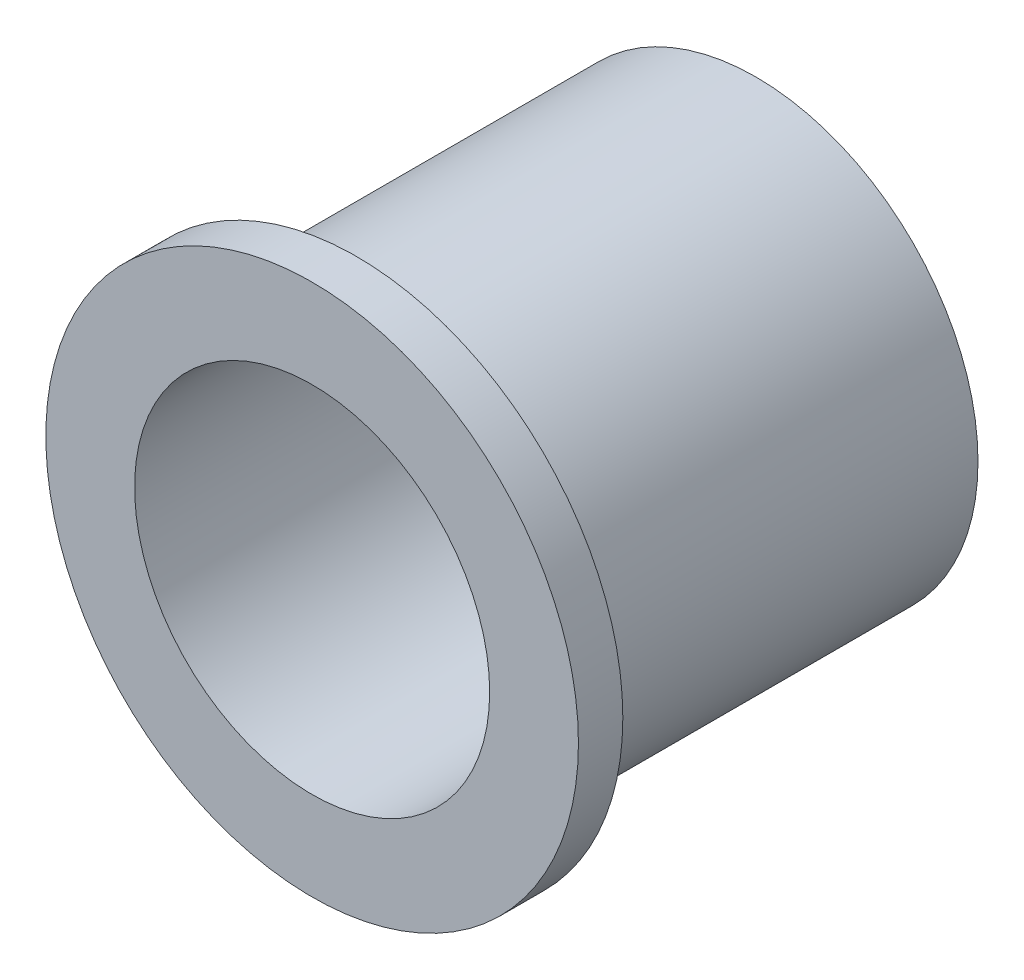
ISO-10303-21;
HEADER;
FILE_DESCRIPTION(('STEP AP214'),'2;1');
FILE_NAME('part.step','',(''),(''),'','','');
FILE_SCHEMA(('AUTOMOTIVE_DESIGN { 1 0 10303 214 1 1 1 1 }'));
ENDSEC;
DATA;
#1=APPLICATION_CONTEXT('core data for automotive mechanical design processes');
#2=APPLICATION_PROTOCOL_DEFINITION('international standard','automotive_design',2000,#1);
#3=PRODUCT_CONTEXT('',#1,'mechanical');
#4=PRODUCT('Part','Part','',(#3));
#5=PRODUCT_RELATED_PRODUCT_CATEGORY('part','',(#4));
#6=PRODUCT_DEFINITION_FORMATION('','',#4);
#7=PRODUCT_DEFINITION_CONTEXT('part definition',#1,'design');
#8=PRODUCT_DEFINITION('design','',#6,#7);
#9=PRODUCT_DEFINITION_SHAPE('','',#8);
#10=(LENGTH_UNIT() NAMED_UNIT(*) SI_UNIT(.MILLI.,.METRE.));
#11=(NAMED_UNIT(*) PLANE_ANGLE_UNIT() SI_UNIT($,.RADIAN.));
#12=(NAMED_UNIT(*) SI_UNIT($,.STERADIAN.) SOLID_ANGLE_UNIT());
#13=UNCERTAINTY_MEASURE_WITH_UNIT(LENGTH_MEASURE(1.E-05),#10,'distance_accuracy_value','');
#14=(GEOMETRIC_REPRESENTATION_CONTEXT(3) GLOBAL_UNCERTAINTY_ASSIGNED_CONTEXT((#13)) GLOBAL_UNIT_ASSIGNED_CONTEXT((#10,
#11,#12)) REPRESENTATION_CONTEXT('',''));
#15=CARTESIAN_POINT('',(0.,0.,0.));
#16=DIRECTION('',(0.,0.,1.));
#17=DIRECTION('',(1.,0.,0.));
#18=AXIS2_PLACEMENT_3D('',#15,#16,#17);
#19=CARTESIAN_POINT('',(0.,0.,15.875));
#20=DIRECTION('',(0.,0.,-1.));
#21=DIRECTION('',(-1.,0.,0.));
#22=AXIS2_PLACEMENT_3D('',#19,#20,#21);
#23=CYLINDRICAL_SURFACE('',#22,15.88135);
#24=CARTESIAN_POINT('',(0.,0.,-15.875));
#25=DIRECTION('',(0.,0.,1.));
#26=DIRECTION('',(1.,0.,0.));
#27=AXIS2_PLACEMENT_3D('',#24,#25,#26);
#28=CIRCLE('',#27,15.88135);
#29=CARTESIAN_POINT('',(15.88135,0.,-15.875));
#30=VERTEX_POINT('',#29);
#31=EDGE_CURVE('E45',#30,#30,#28,.T.);
#32=ORIENTED_EDGE('',*,*,#31,.T.);
#33=EDGE_LOOP('',(#32));
#34=FACE_BOUND('',#33,.T.);
#35=CARTESIAN_POINT('',(0.,0.,12.7));
#36=DIRECTION('',(0.,0.,1.));
#37=DIRECTION('',(1.,0.,0.));
#38=AXIS2_PLACEMENT_3D('',#35,#36,#37);
#39=CIRCLE('',#38,15.88135);
#40=CARTESIAN_POINT('',(15.88135,0.,12.7));
#41=VERTEX_POINT('',#40);
#42=EDGE_CURVE('E10',#41,#41,#39,.T.);
#43=ORIENTED_EDGE('',*,*,#42,.F.);
#44=EDGE_LOOP('',(#43));
#45=FACE_BOUND('',#44,.T.);
#46=ADVANCED_FACE('F34',(#34,#45),#23,.T.);
#47=CARTESIAN_POINT('',(0.,0.,15.875));
#48=DIRECTION('',(0.,0.,1.));
#49=DIRECTION('',(1.,0.,0.));
#50=AXIS2_PLACEMENT_3D('',#47,#48,#49);
#51=PLANE('',#50);
#52=CARTESIAN_POINT('',(0.,0.,15.875));
#53=DIRECTION('',(0.,0.,1.));
#54=DIRECTION('',(1.,0.,0.));
#55=AXIS2_PLACEMENT_3D('',#52,#53,#54);
#56=CIRCLE('',#55,12.7);
#57=CARTESIAN_POINT('',(12.7,0.,15.875));
#58=VERTEX_POINT('',#57);
#59=EDGE_CURVE('E37',#58,#58,#56,.T.);
#60=ORIENTED_EDGE('',*,*,#59,.F.);
#61=EDGE_LOOP('',(#60));
#62=FACE_BOUND('',#61,.T.);
#63=CARTESIAN_POINT('',(0.,0.,15.875));
#64=DIRECTION('',(0.,0.,1.));
#65=DIRECTION('',(1.,0.,0.));
#66=AXIS2_PLACEMENT_3D('',#63,#64,#65);
#67=CIRCLE('',#66,19.05);
#68=CARTESIAN_POINT('',(19.05,0.,15.875));
#69=VERTEX_POINT('',#68);
#70=EDGE_CURVE('E52',#69,#69,#67,.T.);
#71=ORIENTED_EDGE('',*,*,#70,.T.);
#72=EDGE_LOOP('',(#71));
#73=FACE_BOUND('',#72,.T.);
#74=ADVANCED_FACE('F71',(#62,#73),#51,.T.);
#75=CARTESIAN_POINT('',(0.,0.,15.875));
#76=DIRECTION('',(0.,0.,-1.));
#77=DIRECTION('',(-1.,0.,0.));
#78=AXIS2_PLACEMENT_3D('',#75,#76,#77);
#79=CYLINDRICAL_SURFACE('',#78,12.7);
#80=ORIENTED_EDGE('',*,*,#59,.T.);
#81=EDGE_LOOP('',(#80));
#82=FACE_BOUND('',#81,.T.);
#83=CARTESIAN_POINT('',(0.,0.,-15.875));
#84=DIRECTION('',(0.,0.,1.));
#85=DIRECTION('',(1.,0.,0.));
#86=AXIS2_PLACEMENT_3D('',#83,#84,#85);
#87=CIRCLE('',#86,12.7);
#88=CARTESIAN_POINT('',(12.7,0.,-15.875));
#89=VERTEX_POINT('',#88);
#90=EDGE_CURVE('E50',#89,#89,#87,.T.);
#91=ORIENTED_EDGE('',*,*,#90,.F.);
#92=EDGE_LOOP('',(#91));
#93=FACE_BOUND('',#92,.T.);
#94=ADVANCED_FACE('F61',(#82,#93),#79,.F.);
#95=CARTESIAN_POINT('',(0.,0.,-15.875));
#96=DIRECTION('',(0.,0.,1.));
#97=DIRECTION('',(1.,0.,0.));
#98=AXIS2_PLACEMENT_3D('',#95,#96,#97);
#99=PLANE('',#98);
#100=ORIENTED_EDGE('',*,*,#90,.T.);
#101=EDGE_LOOP('',(#100));
#102=FACE_BOUND('',#101,.T.);
#103=ORIENTED_EDGE('',*,*,#31,.F.);
#104=EDGE_LOOP('',(#103));
#105=FACE_BOUND('',#104,.T.);
#106=ADVANCED_FACE('F58',(#102,#105),#99,.F.);
#107=CARTESIAN_POINT('',(0.,0.,12.7));
#108=DIRECTION('',(0.,0.,1.));
#109=DIRECTION('',(1.,0.,0.));
#110=AXIS2_PLACEMENT_3D('',#107,#108,#109);
#111=PLANE('',#110);
#112=CARTESIAN_POINT('',(0.,0.,12.7));
#113=DIRECTION('',(0.,0.,1.));
#114=DIRECTION('',(1.,0.,0.));
#115=AXIS2_PLACEMENT_3D('',#112,#113,#114);
#116=CIRCLE('',#115,19.05);
#117=CARTESIAN_POINT('',(19.05,0.,12.7));
#118=VERTEX_POINT('',#117);
#119=EDGE_CURVE('E48',#118,#118,#116,.T.);
#120=ORIENTED_EDGE('',*,*,#119,.F.);
#121=EDGE_LOOP('',(#120));
#122=FACE_BOUND('',#121,.T.);
#123=ORIENTED_EDGE('',*,*,#42,.T.);
#124=EDGE_LOOP('',(#123));
#125=FACE_BOUND('',#124,.T.);
#126=ADVANCED_FACE('F60',(#122,#125),#111,.F.);
#127=CARTESIAN_POINT('',(0.,0.,15.875));
#128=DIRECTION('',(0.,0.,-1.));
#129=DIRECTION('',(-1.,0.,0.));
#130=AXIS2_PLACEMENT_3D('',#127,#128,#129);
#131=CYLINDRICAL_SURFACE('',#130,19.05);
#132=ORIENTED_EDGE('',*,*,#70,.F.);
#133=EDGE_LOOP('',(#132));
#134=FACE_BOUND('',#133,.T.);
#135=ORIENTED_EDGE('',*,*,#119,.T.);
#136=EDGE_LOOP('',(#135));
#137=FACE_BOUND('',#136,.T.);
#138=ADVANCED_FACE('F68',(#134,#137),#131,.T.);
#139=CLOSED_SHELL('',(#46,#74,#94,#106,#126,#138));
#140=MANIFOLD_SOLID_BREP('B2',#139);
#141=ADVANCED_BREP_SHAPE_REPRESENTATION('',(#18,#140),#14);
#142=SHAPE_DEFINITION_REPRESENTATION(#9,#141);
ENDSEC;
END-ISO-10303-21;
